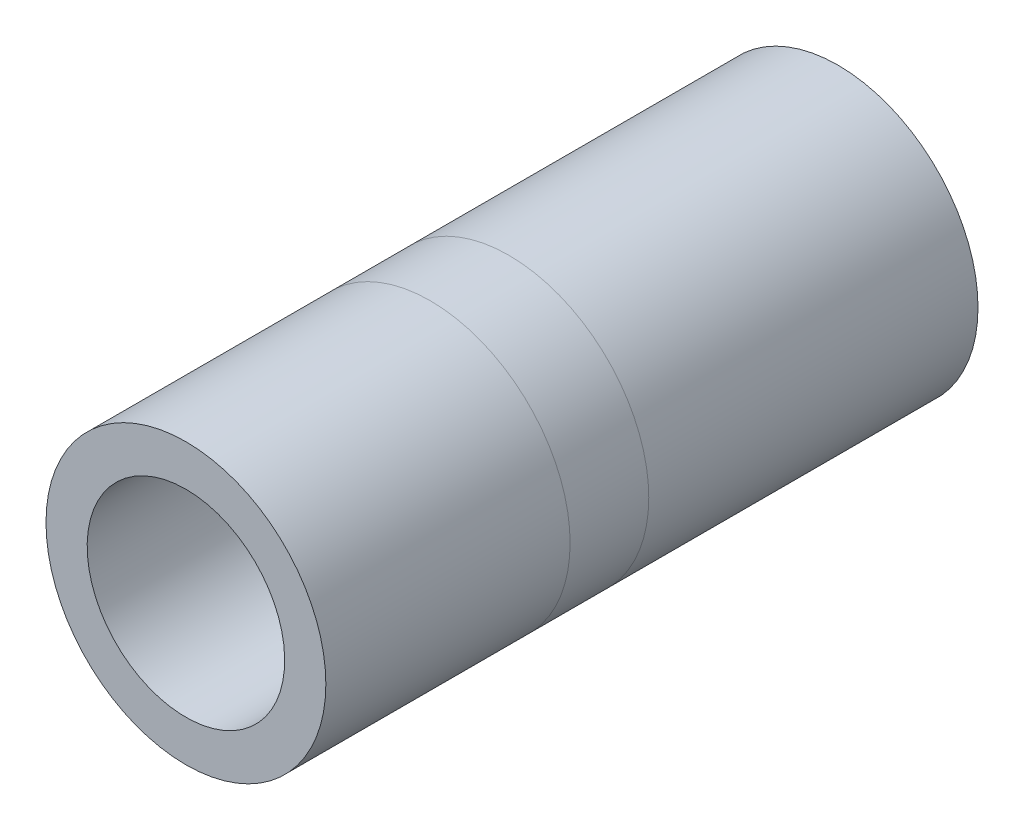
ISO-10303-21;
HEADER;
FILE_DESCRIPTION(('STEP AP214'),'2;1');
FILE_NAME('part.step','',(''),(''),'','','');
FILE_SCHEMA(('AUTOMOTIVE_DESIGN { 1 0 10303 214 1 1 1 1 }'));
ENDSEC;
DATA;
#1=APPLICATION_CONTEXT('core data for automotive mechanical design processes');
#2=APPLICATION_PROTOCOL_DEFINITION('international standard','automotive_design',2000,#1);
#3=PRODUCT_CONTEXT('',#1,'mechanical');
#4=PRODUCT('Part','Part','',(#3));
#5=PRODUCT_RELATED_PRODUCT_CATEGORY('part','',(#4));
#6=PRODUCT_DEFINITION_FORMATION('','',#4);
#7=PRODUCT_DEFINITION_CONTEXT('part definition',#1,'design');
#8=PRODUCT_DEFINITION('design','',#6,#7);
#9=PRODUCT_DEFINITION_SHAPE('','',#8);
#10=(LENGTH_UNIT() NAMED_UNIT(*) SI_UNIT(.MILLI.,.METRE.));
#11=(NAMED_UNIT(*) PLANE_ANGLE_UNIT() SI_UNIT($,.RADIAN.));
#12=(NAMED_UNIT(*) SI_UNIT($,.STERADIAN.) SOLID_ANGLE_UNIT());
#13=UNCERTAINTY_MEASURE_WITH_UNIT(LENGTH_MEASURE(1.E-05),#10,'distance_accuracy_value','');
#14=(GEOMETRIC_REPRESENTATION_CONTEXT(3) GLOBAL_UNCERTAINTY_ASSIGNED_CONTEXT((#13)) GLOBAL_UNIT_ASSIGNED_CONTEXT((#10,
#11,#12)) REPRESENTATION_CONTEXT('',''));
#15=CARTESIAN_POINT('',(0.,0.,0.));
#16=DIRECTION('',(0.,0.,1.));
#17=DIRECTION('',(1.,0.,0.));
#18=AXIS2_PLACEMENT_3D('',#15,#16,#17);
#19=CARTESIAN_POINT('',(0.,-1.17335859502536E-13,-31.7499999999999));
#20=DIRECTION('',(0.,0.,-1.));
#21=DIRECTION('',(0.,1.,0.));
#22=AXIS2_PLACEMENT_3D('',#19,#20,#21);
#23=PLANE('',#22);
#24=CARTESIAN_POINT('',(0.,-1.17335859502536E-13,-31.7499999999999));
#25=DIRECTION('',(0.,0.,-1.));
#26=DIRECTION('',(0.,1.,0.));
#27=AXIS2_PLACEMENT_3D('',#24,#25,#26);
#28=CIRCLE('',#27,9.525);
#29=CARTESIAN_POINT('',(0.,9.52499999999988,-31.7499999999999));
#30=VERTEX_POINT('',#29);
#31=EDGE_CURVE('E76',#30,#30,#28,.T.);
#32=ORIENTED_EDGE('',*,*,#31,.F.);
#33=EDGE_LOOP('',(#32));
#34=FACE_BOUND('',#33,.T.);
#35=CARTESIAN_POINT('',(0.,-1.17335859502536E-13,-31.7499999999999));
#36=DIRECTION('',(0.,0.,-1.));
#37=DIRECTION('',(0.,1.,0.));
#38=AXIS2_PLACEMENT_3D('',#35,#36,#37);
#39=CIRCLE('',#38,13.49375);
#40=CARTESIAN_POINT('',(0.,13.4937499999999,-31.7499999999999));
#41=VERTEX_POINT('',#40);
#42=EDGE_CURVE('E71',#41,#41,#39,.T.);
#43=ORIENTED_EDGE('',*,*,#42,.T.);
#44=EDGE_LOOP('',(#43));
#45=FACE_BOUND('',#44,.T.);
#46=ADVANCED_FACE('F57',(#34,#45),#23,.T.);
#47=CARTESIAN_POINT('',(-9.33949029224834E-13,2.60353369418986E-12,31.1433892729606));
#48=DIRECTION('',(0.,0.,-1.));
#49=DIRECTION('',(0.,1.,0.));
#50=AXIS2_PLACEMENT_3D('',#47,#48,#49);
#51=PLANE('',#50);
#52=CARTESIAN_POINT('',(3.25473876681781E-12,-8.56756071142251E-12,31.1433892729606));
#53=DIRECTION('',(0.,0.,-1.));
#54=DIRECTION('',(0.,1.,0.));
#55=AXIS2_PLACEMENT_3D('',#52,#53,#54);
#56=CIRCLE('',#55,9.525);
#57=CARTESIAN_POINT('',(3.25473876681781E-12,9.52499999999143,31.1433892729606));
#58=VERTEX_POINT('',#57);
#59=EDGE_CURVE('E79',#58,#58,#56,.T.);
#60=ORIENTED_EDGE('',*,*,#59,.T.);
#61=EDGE_LOOP('',(#60));
#62=FACE_BOUND('',#61,.T.);
#63=CARTESIAN_POINT('',(-9.33949029224834E-13,2.60353369418986E-12,31.1433892729606));
#64=DIRECTION('',(0.,0.,-1.));
#65=DIRECTION('',(0.,1.,0.));
#66=AXIS2_PLACEMENT_3D('',#63,#64,#65);
#67=CIRCLE('',#66,13.49375);
#68=CARTESIAN_POINT('',(-9.33949029224834E-13,13.4937500000026,31.1433892729606));
#69=VERTEX_POINT('',#68);
#70=EDGE_CURVE('E11',#69,#69,#67,.T.);
#71=ORIENTED_EDGE('',*,*,#70,.F.);
#72=EDGE_LOOP('',(#71));
#73=FACE_BOUND('',#72,.T.);
#74=ADVANCED_FACE('F89',(#62,#73),#51,.F.);
#75=CARTESIAN_POINT('',(0.,-1.17335859502536E-13,-31.7499999999999));
#76=DIRECTION('',(0.,0.,1.));
#77=DIRECTION('',(1.,0.,0.));
#78=AXIS2_PLACEMENT_3D('',#75,#76,#77);
#79=CYLINDRICAL_SURFACE('',#78,13.49375);
#80=CARTESIAN_POINT('',(0.,-1.17335859502536E-13,0.));
#81=DIRECTION('',(0.,0.,-1.));
#82=DIRECTION('',(0.,1.,0.));
#83=AXIS2_PLACEMENT_3D('',#80,#81,#82);
#84=CIRCLE('',#83,13.49375);
#85=CARTESIAN_POINT('',(0.,13.4937499999999,0.));
#86=VERTEX_POINT('',#85);
#87=EDGE_CURVE('E67',#86,#86,#84,.T.);
#88=ORIENTED_EDGE('',*,*,#87,.T.);
#89=EDGE_LOOP('',(#88));
#90=FACE_BOUND('',#89,.T.);
#91=ORIENTED_EDGE('',*,*,#42,.F.);
#92=EDGE_LOOP('',(#91));
#93=FACE_BOUND('',#92,.T.);
#94=ADVANCED_FACE('F115',(#90,#93),#79,.T.);
#95=CARTESIAN_POINT('',(4.18868779604265E-12,-1.11710944056124E-11,0.));
#96=DIRECTION('',(-1.31727019696161E-13,3.54931136403544E-13,1.));
#97=DIRECTION('',(0.,-1.,3.54931136403544E-13));
#98=AXIS2_PLACEMENT_3D('',#95,#96,#97);
#99=CYLINDRICAL_SURFACE('',#98,13.49375);
#100=CARTESIAN_POINT('',(3.18948707388001E-12,-8.47880357089637E-12,7.58538927296298));
#101=DIRECTION('',(0.,0.,-1.));
#102=DIRECTION('',(0.,1.,0.));
#103=AXIS2_PLACEMENT_3D('',#100,#101,#102);
#104=CIRCLE('',#103,13.49375);
#105=CARTESIAN_POINT('',(3.18948707388001E-12,13.4937499999915,7.58538927296303));
#106=VERTEX_POINT('',#105);
#107=EDGE_CURVE('E63',#106,#106,#104,.T.);
#108=ORIENTED_EDGE('',*,*,#107,.T.);
#109=EDGE_LOOP('',(#108));
#110=FACE_BOUND('',#109,.T.);
#111=ORIENTED_EDGE('',*,*,#87,.F.);
#112=EDGE_LOOP('',(#111));
#113=FACE_BOUND('',#112,.T.);
#114=ADVANCED_FACE('F117',(#110,#113),#99,.T.);
#115=CARTESIAN_POINT('',(-9.99200722162641E-13,2.692290834716E-12,7.58538927296298));
#116=DIRECTION('',(0.,0.,1.));
#117=DIRECTION('',(0.,-1.,0.));
#118=AXIS2_PLACEMENT_3D('',#115,#116,#117);
#119=CYLINDRICAL_SURFACE('',#118,13.49375);
#120=ORIENTED_EDGE('',*,*,#70,.T.);
#121=EDGE_LOOP('',(#120));
#122=FACE_BOUND('',#121,.T.);
#123=ORIENTED_EDGE('',*,*,#107,.F.);
#124=EDGE_LOOP('',(#123));
#125=FACE_BOUND('',#124,.T.);
#126=ADVANCED_FACE('F107',(#122,#125),#119,.T.);
#127=CARTESIAN_POINT('',(0.,-1.17335859502536E-13,-36.75));
#128=DIRECTION('',(0.,0.,1.));
#129=DIRECTION('',(1.,0.,0.));
#130=AXIS2_PLACEMENT_3D('',#127,#128,#129);
#131=CYLINDRICAL_SURFACE('',#130,9.525);
#132=CARTESIAN_POINT('',(0.,-1.17335859502536E-13,0.));
#133=DIRECTION('',(0.,0.,-1.));
#134=DIRECTION('',(0.,1.,0.));
#135=AXIS2_PLACEMENT_3D('',#132,#133,#134);
#136=CIRCLE('',#135,9.525);
#137=CARTESIAN_POINT('',(0.,9.52499999999988,0.));
#138=VERTEX_POINT('',#137);
#139=EDGE_CURVE('E80',#138,#138,#136,.T.);
#140=ORIENTED_EDGE('',*,*,#139,.F.);
#141=EDGE_LOOP('',(#140));
#142=FACE_BOUND('',#141,.T.);
#143=ORIENTED_EDGE('',*,*,#31,.T.);
#144=EDGE_LOOP('',(#143));
#145=FACE_BOUND('',#144,.T.);
#146=ADVANCED_FACE('F97',(#142,#145),#131,.F.);
#147=CARTESIAN_POINT('',(4.18868779604265E-12,-1.11710944056124E-11,0.));
#148=DIRECTION('',(-1.31727019696161E-13,3.54931136403544E-13,1.));
#149=DIRECTION('',(0.,-1.,3.54931136403544E-13));
#150=AXIS2_PLACEMENT_3D('',#147,#148,#149);
#151=CYLINDRICAL_SURFACE('',#150,9.525);
#152=CARTESIAN_POINT('',(3.18948707388001E-12,-8.47880357089637E-12,7.58538927296299));
#153=DIRECTION('',(0.,0.,-1.));
#154=DIRECTION('',(0.,1.,0.));
#155=AXIS2_PLACEMENT_3D('',#152,#153,#154);
#156=CIRCLE('',#155,9.525);
#157=CARTESIAN_POINT('',(3.18948707388001E-12,9.52499999999152,7.58538927296303));
#158=VERTEX_POINT('',#157);
#159=EDGE_CURVE('E83',#158,#158,#156,.T.);
#160=ORIENTED_EDGE('',*,*,#159,.F.);
#161=EDGE_LOOP('',(#160));
#162=FACE_BOUND('',#161,.T.);
#163=ORIENTED_EDGE('',*,*,#139,.T.);
#164=EDGE_LOOP('',(#163));
#165=FACE_BOUND('',#164,.T.);
#166=ADVANCED_FACE('F95',(#162,#165),#151,.F.);
#167=CARTESIAN_POINT('',(3.18948707388001E-12,-8.47880357089637E-12,7.58538927296299));
#168=DIRECTION('',(0.,0.,1.));
#169=DIRECTION('',(0.,-1.,0.));
#170=AXIS2_PLACEMENT_3D('',#167,#168,#169);
#171=CYLINDRICAL_SURFACE('',#170,9.525);
#172=ORIENTED_EDGE('',*,*,#59,.F.);
#173=EDGE_LOOP('',(#172));
#174=FACE_BOUND('',#173,.T.);
#175=ORIENTED_EDGE('',*,*,#159,.T.);
#176=EDGE_LOOP('',(#175));
#177=FACE_BOUND('',#176,.T.);
#178=ADVANCED_FACE('F92',(#174,#177),#171,.F.);
#179=CLOSED_SHELL('',(#46,#74,#94,#114,#126,#146,#166,#178));
#180=MANIFOLD_SOLID_BREP('B2',#179);
#181=ADVANCED_BREP_SHAPE_REPRESENTATION('',(#18,#180),#14);
#182=SHAPE_DEFINITION_REPRESENTATION(#9,#181);
ENDSEC;
END-ISO-10303-21;
